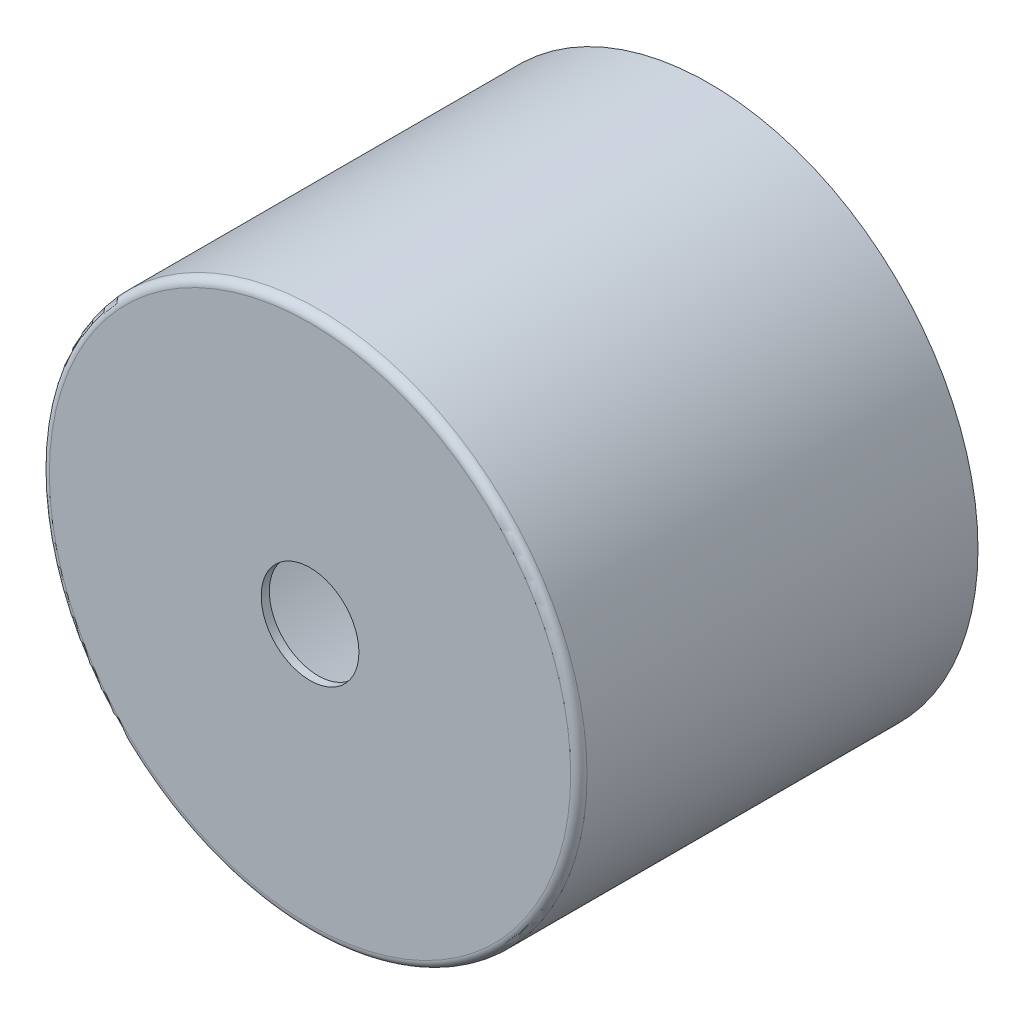
ISO-10303-21;
HEADER;
FILE_DESCRIPTION(('STEP AP214'),'2;1');
FILE_NAME('part.step','',(''),(''),'','','');
FILE_SCHEMA(('AUTOMOTIVE_DESIGN { 1 0 10303 214 1 1 1 1 }'));
ENDSEC;
DATA;
#1=APPLICATION_CONTEXT('core data for automotive mechanical design processes');
#2=APPLICATION_PROTOCOL_DEFINITION('international standard','automotive_design',2000,#1);
#3=PRODUCT_CONTEXT('',#1,'mechanical');
#4=PRODUCT('Part','Part','',(#3));
#5=PRODUCT_RELATED_PRODUCT_CATEGORY('part','',(#4));
#6=PRODUCT_DEFINITION_FORMATION('','',#4);
#7=PRODUCT_DEFINITION_CONTEXT('part definition',#1,'design');
#8=PRODUCT_DEFINITION('design','',#6,#7);
#9=PRODUCT_DEFINITION_SHAPE('','',#8);
#10=(LENGTH_UNIT() NAMED_UNIT(*) SI_UNIT(.MILLI.,.METRE.));
#11=(NAMED_UNIT(*) PLANE_ANGLE_UNIT() SI_UNIT($,.RADIAN.));
#12=(NAMED_UNIT(*) SI_UNIT($,.STERADIAN.) SOLID_ANGLE_UNIT());
#13=UNCERTAINTY_MEASURE_WITH_UNIT(LENGTH_MEASURE(1.E-05),#10,'distance_accuracy_value','');
#14=(GEOMETRIC_REPRESENTATION_CONTEXT(3) GLOBAL_UNCERTAINTY_ASSIGNED_CONTEXT((#13)) GLOBAL_UNIT_ASSIGNED_CONTEXT((#10,
#11,#12)) REPRESENTATION_CONTEXT('',''));
#15=CARTESIAN_POINT('',(0.,0.,0.));
#16=DIRECTION('',(0.,0.,1.));
#17=DIRECTION('',(1.,0.,0.));
#18=AXIS2_PLACEMENT_3D('',#15,#16,#17);
#19=CARTESIAN_POINT('',(0.,0.,-24.5));
#20=DIRECTION('',(0.,0.,1.));
#21=DIRECTION('',(1.,0.,0.));
#22=AXIS2_PLACEMENT_3D('',#19,#20,#21);
#23=CYLINDRICAL_SURFACE('',#22,16.5);
#24=CARTESIAN_POINT('',(0.,0.,-0.5));
#25=DIRECTION('',(0.,0.,1.));
#26=DIRECTION('',(1.,0.,0.));
#27=AXIS2_PLACEMENT_3D('',#24,#25,#26);
#28=CIRCLE('',#27,16.5);
#29=CARTESIAN_POINT('',(16.5,0.,-0.5));
#30=VERTEX_POINT('',#29);
#31=EDGE_CURVE('E10',#30,#30,#28,.F.);
#32=ORIENTED_EDGE('',*,*,#31,.T.);
#33=EDGE_LOOP('',(#32));
#34=FACE_BOUND('',#33,.T.);
#35=CARTESIAN_POINT('',(0.,0.,-24.5));
#36=DIRECTION('',(0.,0.,1.));
#37=DIRECTION('',(1.,0.,0.));
#38=AXIS2_PLACEMENT_3D('',#35,#36,#37);
#39=CIRCLE('',#38,16.5);
#40=CARTESIAN_POINT('',(16.5,0.,-24.5));
#41=VERTEX_POINT('',#40);
#42=EDGE_CURVE('E50',#41,#41,#39,.T.);
#43=ORIENTED_EDGE('',*,*,#42,.T.);
#44=EDGE_LOOP('',(#43));
#45=FACE_BOUND('',#44,.T.);
#46=ADVANCED_FACE('F37',(#34,#45),#23,.T.);
#47=CARTESIAN_POINT('',(0.,0.,-24.5));
#48=DIRECTION('',(0.,0.,1.));
#49=DIRECTION('',(1.,0.,0.));
#50=AXIS2_PLACEMENT_3D('',#47,#48,#49);
#51=PLANE('',#50);
#52=CARTESIAN_POINT('',(0.,0.,-24.5));
#53=DIRECTION('',(0.,0.,1.));
#54=DIRECTION('',(1.,0.,0.));
#55=AXIS2_PLACEMENT_3D('',#52,#53,#54);
#56=CIRCLE('',#55,16.);
#57=CARTESIAN_POINT('',(16.,0.,-24.5));
#58=VERTEX_POINT('',#57);
#59=EDGE_CURVE('E55',#58,#58,#56,.T.);
#60=ORIENTED_EDGE('',*,*,#59,.T.);
#61=EDGE_LOOP('',(#60));
#62=FACE_BOUND('',#61,.T.);
#63=ORIENTED_EDGE('',*,*,#42,.F.);
#64=EDGE_LOOP('',(#63));
#65=FACE_BOUND('',#64,.T.);
#66=ADVANCED_FACE('F80',(#62,#65),#51,.F.);
#67=CARTESIAN_POINT('',(0.,0.,0.));
#68=DIRECTION('',(0.,0.,1.));
#69=DIRECTION('',(1.,0.,0.));
#70=AXIS2_PLACEMENT_3D('',#67,#68,#69);
#71=PLANE('',#70);
#72=CARTESIAN_POINT('',(0.,0.,0.));
#73=DIRECTION('',(0.,0.,1.));
#74=DIRECTION('',(1.,0.,0.));
#75=AXIS2_PLACEMENT_3D('',#72,#73,#74);
#76=CIRCLE('',#75,16.);
#77=CARTESIAN_POINT('',(16.,0.,0.));
#78=VERTEX_POINT('',#77);
#79=EDGE_CURVE('E45',#78,#78,#76,.T.);
#80=ORIENTED_EDGE('',*,*,#79,.T.);
#81=EDGE_LOOP('',(#80));
#82=FACE_BOUND('',#81,.T.);
#83=CARTESIAN_POINT('',(0.,0.,0.));
#84=DIRECTION('',(0.,0.,1.));
#85=DIRECTION('',(1.,0.,0.));
#86=AXIS2_PLACEMENT_3D('',#83,#84,#85);
#87=CIRCLE('',#86,3.);
#88=CARTESIAN_POINT('',(3.,0.,0.));
#89=VERTEX_POINT('',#88);
#90=EDGE_CURVE('E62',#89,#89,#87,.T.);
#91=ORIENTED_EDGE('',*,*,#90,.F.);
#92=EDGE_LOOP('',(#91));
#93=FACE_BOUND('',#92,.T.);
#94=ADVANCED_FACE('F77',(#82,#93),#71,.T.);
#95=CARTESIAN_POINT('',(0.,0.,-24.5));
#96=DIRECTION('',(0.,0.,1.));
#97=DIRECTION('',(1.,0.,0.));
#98=AXIS2_PLACEMENT_3D('',#95,#96,#97);
#99=CYLINDRICAL_SURFACE('',#98,16.);
#100=ORIENTED_EDGE('',*,*,#59,.F.);
#101=EDGE_LOOP('',(#100));
#102=FACE_BOUND('',#101,.T.);
#103=CARTESIAN_POINT('',(0.,0.,-0.5));
#104=DIRECTION('',(0.,0.,1.));
#105=DIRECTION('',(1.,0.,0.));
#106=AXIS2_PLACEMENT_3D('',#103,#104,#105);
#107=CIRCLE('',#106,16.);
#108=CARTESIAN_POINT('',(16.,0.,-0.5));
#109=VERTEX_POINT('',#108);
#110=EDGE_CURVE('E61',#109,#109,#107,.T.);
#111=ORIENTED_EDGE('',*,*,#110,.T.);
#112=EDGE_LOOP('',(#111));
#113=FACE_BOUND('',#112,.T.);
#114=ADVANCED_FACE('F79',(#102,#113),#99,.F.);
#115=CARTESIAN_POINT('',(0.,0.,-0.5));
#116=DIRECTION('',(0.,0.,1.));
#117=DIRECTION('',(1.,0.,0.));
#118=AXIS2_PLACEMENT_3D('',#115,#116,#117);
#119=PLANE('',#118);
#120=CARTESIAN_POINT('',(0.,0.,-0.5));
#121=DIRECTION('',(0.,0.,1.));
#122=DIRECTION('',(1.,0.,0.));
#123=AXIS2_PLACEMENT_3D('',#120,#121,#122);
#124=CIRCLE('',#123,3.);
#125=CARTESIAN_POINT('',(3.,0.,-0.5));
#126=VERTEX_POINT('',#125);
#127=EDGE_CURVE('E58',#126,#126,#124,.T.);
#128=ORIENTED_EDGE('',*,*,#127,.T.);
#129=EDGE_LOOP('',(#128));
#130=FACE_BOUND('',#129,.T.);
#131=ORIENTED_EDGE('',*,*,#110,.F.);
#132=EDGE_LOOP('',(#131));
#133=FACE_BOUND('',#132,.T.);
#134=ADVANCED_FACE('F86',(#130,#133),#119,.F.);
#135=CARTESIAN_POINT('',(0.,0.,-24.5));
#136=DIRECTION('',(0.,0.,1.));
#137=DIRECTION('',(1.,0.,0.));
#138=AXIS2_PLACEMENT_3D('',#135,#136,#137);
#139=CYLINDRICAL_SURFACE('',#138,3.);
#140=ORIENTED_EDGE('',*,*,#90,.T.);
#141=EDGE_LOOP('',(#140));
#142=FACE_BOUND('',#141,.T.);
#143=ORIENTED_EDGE('',*,*,#127,.F.);
#144=EDGE_LOOP('',(#143));
#145=FACE_BOUND('',#144,.T.);
#146=ADVANCED_FACE('F74',(#142,#145),#139,.F.);
#147=CARTESIAN_POINT('',(0.,0.,-0.5));
#148=DIRECTION('',(0.,0.,1.));
#149=DIRECTION('',(1.,0.,0.));
#150=AXIS2_PLACEMENT_3D('',#147,#148,#149);
#151=TOROIDAL_SURFACE('',#150,16.,0.5);
#152=ORIENTED_EDGE('',*,*,#31,.F.);
#153=EDGE_LOOP('',(#152));
#154=FACE_BOUND('',#153,.T.);
#155=ORIENTED_EDGE('',*,*,#79,.F.);
#156=EDGE_LOOP('',(#155));
#157=FACE_BOUND('',#156,.T.);
#158=ADVANCED_FACE('F39',(#154,#157),#151,.T.);
#159=CLOSED_SHELL('',(#46,#66,#94,#114,#134,#146,#158));
#160=MANIFOLD_SOLID_BREP('B2',#159);
#161=ADVANCED_BREP_SHAPE_REPRESENTATION('',(#18,#160),#14);
#162=SHAPE_DEFINITION_REPRESENTATION(#9,#161);
ENDSEC;
END-ISO-10303-21;
